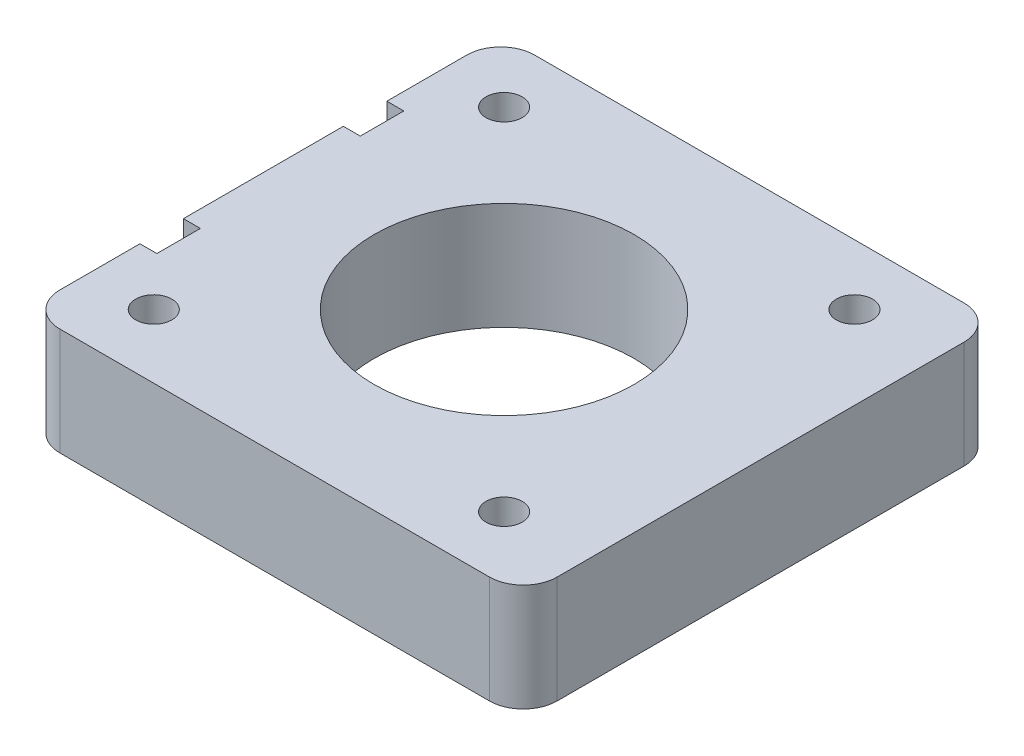
ISO-10303-21;
HEADER;
FILE_DESCRIPTION(('STEP AP214'),'2;1');
FILE_NAME('part.step','',(''),(''),'','','');
FILE_SCHEMA(('AUTOMOTIVE_DESIGN { 1 0 10303 214 1 1 1 1 }'));
ENDSEC;
DATA;
#1=APPLICATION_CONTEXT('core data for automotive mechanical design processes');
#2=APPLICATION_PROTOCOL_DEFINITION('international standard','automotive_design',2000,#1);
#3=PRODUCT_CONTEXT('',#1,'mechanical');
#4=PRODUCT('Part','Part','',(#3));
#5=PRODUCT_RELATED_PRODUCT_CATEGORY('part','',(#4));
#6=PRODUCT_DEFINITION_FORMATION('','',#4);
#7=PRODUCT_DEFINITION_CONTEXT('part definition',#1,'design');
#8=PRODUCT_DEFINITION('design','',#6,#7);
#9=PRODUCT_DEFINITION_SHAPE('','',#8);
#10=(LENGTH_UNIT() NAMED_UNIT(*) SI_UNIT(.MILLI.,.METRE.));
#11=(NAMED_UNIT(*) PLANE_ANGLE_UNIT() SI_UNIT($,.RADIAN.));
#12=(NAMED_UNIT(*) SI_UNIT($,.STERADIAN.) SOLID_ANGLE_UNIT());
#13=UNCERTAINTY_MEASURE_WITH_UNIT(LENGTH_MEASURE(1.E-05),#10,'distance_accuracy_value','');
#14=(GEOMETRIC_REPRESENTATION_CONTEXT(3) GLOBAL_UNCERTAINTY_ASSIGNED_CONTEXT((#13)) GLOBAL_UNIT_ASSIGNED_CONTEXT((#10,
#11,#12)) REPRESENTATION_CONTEXT('',''));
#15=CARTESIAN_POINT('',(0.,0.,0.));
#16=DIRECTION('',(0.,0.,1.));
#17=DIRECTION('',(1.,0.,0.));
#18=AXIS2_PLACEMENT_3D('',#15,#16,#17);
#19=CARTESIAN_POINT('',(0.,9.5,0.));
#20=DIRECTION('',(1.,0.,0.));
#21=DIRECTION('',(0.,0.,-1.));
#22=AXIS2_PLACEMENT_3D('',#19,#20,#21);
#23=PLANE('',#22);
#24=DIRECTION('',(0.,0.,1.));
#25=VECTOR('',#24,1.);
#26=CARTESIAN_POINT('',(0.,0.,0.));
#27=LINE('',#26,#25);
#28=CARTESIAN_POINT('',(0.,0.,3.));
#29=VERTEX_POINT('',#28);
#30=CARTESIAN_POINT('',(0.,0.,10.075));
#31=VERTEX_POINT('',#30);
#32=EDGE_CURVE('E245',#29,#31,#27,.T.);
#33=ORIENTED_EDGE('',*,*,#32,.T.);
#34=DIRECTION('',(0.,-1.,0.));
#35=VECTOR('',#34,1.);
#36=CARTESIAN_POINT('',(0.,9.5,10.075));
#37=LINE('',#36,#35);
#38=CARTESIAN_POINT('',(0.,9.5,10.075));
#39=VERTEX_POINT('',#38);
#40=EDGE_CURVE('E192',#39,#31,#37,.T.);
#41=ORIENTED_EDGE('',*,*,#40,.F.);
#42=DIRECTION('',(0.,0.,1.));
#43=VECTOR('',#42,1.);
#44=CARTESIAN_POINT('',(0.,9.5,0.));
#45=LINE('',#44,#43);
#46=CARTESIAN_POINT('',(0.,9.5,3.));
#47=VERTEX_POINT('',#46);
#48=EDGE_CURVE('E230',#47,#39,#45,.T.);
#49=ORIENTED_EDGE('',*,*,#48,.F.);
#50=DIRECTION('',(0.,-1.,0.));
#51=VECTOR('',#50,1.);
#52=CARTESIAN_POINT('',(0.,9.5,3.));
#53=LINE('',#52,#51);
#54=EDGE_CURVE('E286',#47,#29,#53,.T.);
#55=ORIENTED_EDGE('',*,*,#54,.T.);
#56=EDGE_LOOP('',(#33,#41,#49,#55));
#57=FACE_BOUND('',#56,.T.);
#58=ADVANCED_FACE('F35',(#57),#23,.F.);
#59=CARTESIAN_POINT('',(0.,9.5,13.925));
#60=VERTEX_POINT('',#59);
#61=CARTESIAN_POINT('',(0.,9.5,28.075));
#62=VERTEX_POINT('',#61);
#63=EDGE_CURVE('E234',#60,#62,#45,.T.);
#64=ORIENTED_EDGE('',*,*,#63,.F.);
#65=DIRECTION('',(0.,1.,0.));
#66=VECTOR('',#65,1.);
#67=CARTESIAN_POINT('',(0.,9.5,13.925));
#68=LINE('',#67,#66);
#69=CARTESIAN_POINT('',(0.,0.,13.925));
#70=VERTEX_POINT('',#69);
#71=EDGE_CURVE('E326',#70,#60,#68,.T.);
#72=ORIENTED_EDGE('',*,*,#71,.F.);
#73=CARTESIAN_POINT('',(0.,0.,28.075));
#74=VERTEX_POINT('',#73);
#75=EDGE_CURVE('E169',#70,#74,#27,.T.);
#76=ORIENTED_EDGE('',*,*,#75,.T.);
#77=DIRECTION('',(0.,-1.,0.));
#78=VECTOR('',#77,1.);
#79=CARTESIAN_POINT('',(0.,9.5,28.075));
#80=LINE('',#79,#78);
#81=EDGE_CURVE('E187',#62,#74,#80,.T.);
#82=ORIENTED_EDGE('',*,*,#81,.F.);
#83=EDGE_LOOP('',(#64,#72,#76,#82));
#84=FACE_BOUND('',#83,.T.);
#85=ADVANCED_FACE('F336',(#84),#23,.F.);
#86=CARTESIAN_POINT('',(0.,9.5,31.925));
#87=VERTEX_POINT('',#86);
#88=CARTESIAN_POINT('',(0.,9.5,39.));
#89=VERTEX_POINT('',#88);
#90=EDGE_CURVE('E235',#87,#89,#45,.T.);
#91=ORIENTED_EDGE('',*,*,#90,.F.);
#92=DIRECTION('',(0.,1.,0.));
#93=VECTOR('',#92,1.);
#94=CARTESIAN_POINT('',(0.,9.5,31.925));
#95=LINE('',#94,#93);
#96=CARTESIAN_POINT('',(0.,0.,31.925));
#97=VERTEX_POINT('',#96);
#98=EDGE_CURVE('E179',#97,#87,#95,.T.);
#99=ORIENTED_EDGE('',*,*,#98,.F.);
#100=CARTESIAN_POINT('',(0.,0.,39.));
#101=VERTEX_POINT('',#100);
#102=EDGE_CURVE('E227',#97,#101,#27,.T.);
#103=ORIENTED_EDGE('',*,*,#102,.T.);
#104=DIRECTION('',(0.,-1.,0.));
#105=VECTOR('',#104,1.);
#106=CARTESIAN_POINT('',(0.,9.5,39.));
#107=LINE('',#106,#105);
#108=EDGE_CURVE('E283',#101,#89,#107,.F.);
#109=ORIENTED_EDGE('',*,*,#108,.T.);
#110=EDGE_LOOP('',(#91,#99,#103,#109));
#111=FACE_BOUND('',#110,.T.);
#112=ADVANCED_FACE('F342',(#111),#23,.F.);
#113=CARTESIAN_POINT('',(0.,9.5,42.));
#114=DIRECTION('',(0.,0.,-1.));
#115=DIRECTION('',(-1.,0.,0.));
#116=AXIS2_PLACEMENT_3D('',#113,#114,#115);
#117=PLANE('',#116);
#118=DIRECTION('',(1.,0.,0.));
#119=VECTOR('',#118,1.);
#120=CARTESIAN_POINT('',(0.,9.5,42.));
#121=LINE('',#120,#119);
#122=CARTESIAN_POINT('',(3.,9.5,42.));
#123=VERTEX_POINT('',#122);
#124=CARTESIAN_POINT('',(41.,9.5,42.));
#125=VERTEX_POINT('',#124);
#126=EDGE_CURVE('E233',#123,#125,#121,.T.);
#127=ORIENTED_EDGE('',*,*,#126,.F.);
#128=DIRECTION('',(0.,-1.,0.));
#129=VECTOR('',#128,1.);
#130=CARTESIAN_POINT('',(3.,9.5,42.));
#131=LINE('',#130,#129);
#132=CARTESIAN_POINT('',(3.,0.,42.));
#133=VERTEX_POINT('',#132);
#134=EDGE_CURVE('E11',#123,#133,#131,.T.);
#135=ORIENTED_EDGE('',*,*,#134,.T.);
#136=DIRECTION('',(1.,0.,0.));
#137=VECTOR('',#136,1.);
#138=CARTESIAN_POINT('',(0.,0.,42.));
#139=LINE('',#138,#137);
#140=CARTESIAN_POINT('',(41.,0.,42.));
#141=VERTEX_POINT('',#140);
#142=EDGE_CURVE('E248',#133,#141,#139,.T.);
#143=ORIENTED_EDGE('',*,*,#142,.T.);
#144=DIRECTION('',(0.,-1.,0.));
#145=VECTOR('',#144,1.);
#146=CARTESIAN_POINT('',(41.,9.5,42.));
#147=LINE('',#146,#145);
#148=EDGE_CURVE('E43',#141,#125,#147,.F.);
#149=ORIENTED_EDGE('',*,*,#148,.T.);
#150=EDGE_LOOP('',(#127,#135,#143,#149));
#151=FACE_BOUND('',#150,.T.);
#152=ADVANCED_FACE('F291',(#151),#117,.F.);
#153=CARTESIAN_POINT('',(44.,9.5,0.));
#154=DIRECTION('',(-1.,0.,0.));
#155=DIRECTION('',(0.,0.,1.));
#156=AXIS2_PLACEMENT_3D('',#153,#154,#155);
#157=PLANE('',#156);
#158=DIRECTION('',(0.,0.,-1.));
#159=VECTOR('',#158,1.);
#160=CARTESIAN_POINT('',(44.,0.,0.));
#161=LINE('',#160,#159);
#162=CARTESIAN_POINT('',(44.,0.,39.));
#163=VERTEX_POINT('',#162);
#164=CARTESIAN_POINT('',(44.,0.,3.));
#165=VERTEX_POINT('',#164);
#166=EDGE_CURVE('E251',#163,#165,#161,.T.);
#167=ORIENTED_EDGE('',*,*,#166,.T.);
#168=DIRECTION('',(0.,-1.,0.));
#169=VECTOR('',#168,1.);
#170=CARTESIAN_POINT('',(44.,9.5,3.));
#171=LINE('',#170,#169);
#172=CARTESIAN_POINT('',(44.,9.5,3.));
#173=VERTEX_POINT('',#172);
#174=EDGE_CURVE('E273',#165,#173,#171,.F.);
#175=ORIENTED_EDGE('',*,*,#174,.T.);
#176=DIRECTION('',(0.,0.,-1.));
#177=VECTOR('',#176,1.);
#178=CARTESIAN_POINT('',(44.,9.5,0.));
#179=LINE('',#178,#177);
#180=CARTESIAN_POINT('',(44.,9.5,39.));
#181=VERTEX_POINT('',#180);
#182=EDGE_CURVE('E238',#181,#173,#179,.T.);
#183=ORIENTED_EDGE('',*,*,#182,.F.);
#184=DIRECTION('',(0.,-1.,0.));
#185=VECTOR('',#184,1.);
#186=CARTESIAN_POINT('',(44.,9.5,39.));
#187=LINE('',#186,#185);
#188=EDGE_CURVE('E270',#181,#163,#187,.T.);
#189=ORIENTED_EDGE('',*,*,#188,.T.);
#190=EDGE_LOOP('',(#167,#175,#183,#189));
#191=FACE_BOUND('',#190,.T.);
#192=ADVANCED_FACE('F305',(#191),#157,.F.);
#193=CARTESIAN_POINT('',(0.,9.5,0.));
#194=DIRECTION('',(0.,0.,1.));
#195=DIRECTION('',(1.,0.,0.));
#196=AXIS2_PLACEMENT_3D('',#193,#194,#195);
#197=PLANE('',#196);
#198=DIRECTION('',(-1.,0.,0.));
#199=VECTOR('',#198,1.);
#200=CARTESIAN_POINT('',(0.,9.5,0.));
#201=LINE('',#200,#199);
#202=CARTESIAN_POINT('',(41.,9.5,0.));
#203=VERTEX_POINT('',#202);
#204=CARTESIAN_POINT('',(3.,9.5,0.));
#205=VERTEX_POINT('',#204);
#206=EDGE_CURVE('E241',#203,#205,#201,.T.);
#207=ORIENTED_EDGE('',*,*,#206,.F.);
#208=DIRECTION('',(0.,-1.,0.));
#209=VECTOR('',#208,1.);
#210=CARTESIAN_POINT('',(41.,9.5,0.));
#211=LINE('',#210,#209);
#212=CARTESIAN_POINT('',(41.,0.,0.));
#213=VERTEX_POINT('',#212);
#214=EDGE_CURVE('E258',#203,#213,#211,.T.);
#215=ORIENTED_EDGE('',*,*,#214,.T.);
#216=DIRECTION('',(-1.,0.,0.));
#217=VECTOR('',#216,1.);
#218=CARTESIAN_POINT('',(0.,0.,0.));
#219=LINE('',#218,#217);
#220=CARTESIAN_POINT('',(3.,0.,0.));
#221=VERTEX_POINT('',#220);
#222=EDGE_CURVE('E254',#213,#221,#219,.T.);
#223=ORIENTED_EDGE('',*,*,#222,.T.);
#224=DIRECTION('',(0.,-1.,0.));
#225=VECTOR('',#224,1.);
#226=CARTESIAN_POINT('',(3.,9.5,0.));
#227=LINE('',#226,#225);
#228=EDGE_CURVE('E244',#221,#205,#227,.F.);
#229=ORIENTED_EDGE('',*,*,#228,.T.);
#230=EDGE_LOOP('',(#207,#215,#223,#229));
#231=FACE_BOUND('',#230,.T.);
#232=ADVANCED_FACE('F314',(#231),#197,.F.);
#233=CARTESIAN_POINT('',(0.,9.5,0.));
#234=DIRECTION('',(0.,1.,0.));
#235=DIRECTION('',(0.,0.,1.));
#236=AXIS2_PLACEMENT_3D('',#233,#234,#235);
#237=PLANE('',#236);
#238=DIRECTION('',(-1.,0.,0.));
#239=VECTOR('',#238,1.);
#240=CARTESIAN_POINT('',(1.5,9.5,10.075));
#241=LINE('',#240,#239);
#242=CARTESIAN_POINT('',(1.5,9.5,10.075));
#243=VERTEX_POINT('',#242);
#244=EDGE_CURVE('E172',#243,#39,#241,.T.);
#245=ORIENTED_EDGE('',*,*,#244,.F.);
#246=DIRECTION('',(0.,0.,-1.));
#247=VECTOR('',#246,1.);
#248=CARTESIAN_POINT('',(1.5,9.5,10.075));
#249=LINE('',#248,#247);
#250=CARTESIAN_POINT('',(1.5,9.5,13.925));
#251=VERTEX_POINT('',#250);
#252=EDGE_CURVE('E157',#251,#243,#249,.T.);
#253=ORIENTED_EDGE('',*,*,#252,.F.);
#254=DIRECTION('',(-1.,0.,0.));
#255=VECTOR('',#254,1.);
#256=CARTESIAN_POINT('',(1.5,9.5,13.925));
#257=LINE('',#256,#255);
#258=EDGE_CURVE('E155',#251,#60,#257,.T.);
#259=ORIENTED_EDGE('',*,*,#258,.T.);
#260=ORIENTED_EDGE('',*,*,#63,.T.);
#261=DIRECTION('',(-1.,0.,0.));
#262=VECTOR('',#261,1.);
#263=CARTESIAN_POINT('',(1.5,9.5,28.075));
#264=LINE('',#263,#262);
#265=CARTESIAN_POINT('',(1.5,9.5,28.075));
#266=VERTEX_POINT('',#265);
#267=EDGE_CURVE('E190',#266,#62,#264,.T.);
#268=ORIENTED_EDGE('',*,*,#267,.F.);
#269=DIRECTION('',(0.,0.,-1.));
#270=VECTOR('',#269,1.);
#271=CARTESIAN_POINT('',(1.5,9.5,28.075));
#272=LINE('',#271,#270);
#273=CARTESIAN_POINT('',(1.5,9.5,31.925));
#274=VERTEX_POINT('',#273);
#275=EDGE_CURVE('E184',#274,#266,#272,.T.);
#276=ORIENTED_EDGE('',*,*,#275,.F.);
#277=DIRECTION('',(-1.,0.,0.));
#278=VECTOR('',#277,1.);
#279=CARTESIAN_POINT('',(1.5,9.5,31.925));
#280=LINE('',#279,#278);
#281=EDGE_CURVE('E193',#274,#87,#280,.T.);
#282=ORIENTED_EDGE('',*,*,#281,.T.);
#283=ORIENTED_EDGE('',*,*,#90,.T.);
#284=CARTESIAN_POINT('',(3.,9.5,39.));
#285=DIRECTION('',(0.,1.,0.));
#286=DIRECTION('',(0.,0.,1.));
#287=AXIS2_PLACEMENT_3D('',#284,#285,#286);
#288=CIRCLE('',#287,3.);
#289=EDGE_CURVE('E277',#89,#123,#288,.T.);
#290=ORIENTED_EDGE('',*,*,#289,.T.);
#291=ORIENTED_EDGE('',*,*,#126,.T.);
#292=CARTESIAN_POINT('',(41.,9.5,39.));
#293=DIRECTION('',(0.,1.,0.));
#294=DIRECTION('',(0.,0.,1.));
#295=AXIS2_PLACEMENT_3D('',#292,#293,#294);
#296=CIRCLE('',#295,3.);
#297=EDGE_CURVE('E275',#125,#181,#296,.T.);
#298=ORIENTED_EDGE('',*,*,#297,.T.);
#299=ORIENTED_EDGE('',*,*,#182,.T.);
#300=CARTESIAN_POINT('',(41.,9.5,3.));
#301=DIRECTION('',(0.,1.,0.));
#302=DIRECTION('',(0.,0.,1.));
#303=AXIS2_PLACEMENT_3D('',#300,#301,#302);
#304=CIRCLE('',#303,3.);
#305=EDGE_CURVE('E281',#173,#203,#304,.T.);
#306=ORIENTED_EDGE('',*,*,#305,.T.);
#307=ORIENTED_EDGE('',*,*,#206,.T.);
#308=CARTESIAN_POINT('',(3.,9.5,3.));
#309=DIRECTION('',(0.,1.,0.));
#310=DIRECTION('',(0.,0.,1.));
#311=AXIS2_PLACEMENT_3D('',#308,#309,#310);
#312=CIRCLE('',#311,3.);
#313=EDGE_CURVE('E279',#205,#47,#312,.T.);
#314=ORIENTED_EDGE('',*,*,#313,.T.);
#315=ORIENTED_EDGE('',*,*,#48,.T.);
#316=EDGE_LOOP('',(#245,#253,#259,#260,#268,#276,#282,#283,#290,#291,#298,#299,#306,#307,#314,#315));
#317=FACE_BOUND('',#316,.T.);
#318=CARTESIAN_POINT('',(36.65,9.5,5.34999999999999));
#319=DIRECTION('',(0.,-1.,0.));
#320=DIRECTION('',(0.,0.,-1.));
#321=AXIS2_PLACEMENT_3D('',#318,#319,#320);
#322=CIRCLE('',#321,1.6);
#323=CARTESIAN_POINT('',(36.65,9.5,3.75));
#324=VERTEX_POINT('',#323);
#325=EDGE_CURVE('E212',#324,#324,#322,.T.);
#326=ORIENTED_EDGE('',*,*,#325,.T.);
#327=EDGE_LOOP('',(#326));
#328=FACE_BOUND('',#327,.T.);
#329=CARTESIAN_POINT('',(5.65,9.5,5.35000000000088));
#330=DIRECTION('',(0.,-1.,0.));
#331=DIRECTION('',(0.,0.,-1.));
#332=AXIS2_PLACEMENT_3D('',#329,#330,#331);
#333=CIRCLE('',#332,1.6);
#334=CARTESIAN_POINT('',(5.65,9.5,3.75000000000088));
#335=VERTEX_POINT('',#334);
#336=EDGE_CURVE('E206',#335,#335,#333,.T.);
#337=ORIENTED_EDGE('',*,*,#336,.T.);
#338=EDGE_LOOP('',(#337));
#339=FACE_BOUND('',#338,.T.);
#340=CARTESIAN_POINT('',(5.65000000000089,9.5,36.3500000000009));
#341=DIRECTION('',(0.,-1.,0.));
#342=DIRECTION('',(0.,0.,-1.));
#343=AXIS2_PLACEMENT_3D('',#340,#341,#342);
#344=CIRCLE('',#343,1.6);
#345=CARTESIAN_POINT('',(5.65000000000089,9.5,34.7500000000009));
#346=VERTEX_POINT('',#345);
#347=EDGE_CURVE('E199',#346,#346,#344,.T.);
#348=ORIENTED_EDGE('',*,*,#347,.T.);
#349=EDGE_LOOP('',(#348));
#350=FACE_BOUND('',#349,.T.);
#351=CARTESIAN_POINT('',(36.6500000000009,9.5,36.35));
#352=DIRECTION('',(0.,-1.,0.));
#353=DIRECTION('',(0.,0.,-1.));
#354=AXIS2_PLACEMENT_3D('',#351,#352,#353);
#355=CIRCLE('',#354,1.6);
#356=CARTESIAN_POINT('',(36.6500000000009,9.5,34.75));
#357=VERTEX_POINT('',#356);
#358=EDGE_CURVE('E218',#357,#357,#355,.T.);
#359=ORIENTED_EDGE('',*,*,#358,.T.);
#360=EDGE_LOOP('',(#359));
#361=FACE_BOUND('',#360,.T.);
#362=CARTESIAN_POINT('',(21.1499999999992,9.5,20.8499999999997));
#363=DIRECTION('',(0.,1.,0.));
#364=DIRECTION('',(0.,0.,1.));
#365=AXIS2_PLACEMENT_3D('',#362,#363,#364);
#366=CIRCLE('',#365,11.5);
#367=CARTESIAN_POINT('',(21.1499999999992,9.5,32.3499999999997));
#368=VERTEX_POINT('',#367);
#369=EDGE_CURVE('E221',#368,#368,#366,.T.);
#370=ORIENTED_EDGE('',*,*,#369,.F.);
#371=EDGE_LOOP('',(#370));
#372=FACE_BOUND('',#371,.T.);
#373=ADVANCED_FACE('F298',(#317,#328,#339,#350,#361,#372),#237,.T.);
#374=CARTESIAN_POINT('',(0.,0.,0.));
#375=DIRECTION('',(0.,1.,0.));
#376=DIRECTION('',(0.,0.,1.));
#377=AXIS2_PLACEMENT_3D('',#374,#375,#376);
#378=PLANE('',#377);
#379=CARTESIAN_POINT('',(36.65,0.,5.34999999999999));
#380=DIRECTION('',(0.,-1.,0.));
#381=DIRECTION('',(0.,0.,-1.));
#382=AXIS2_PLACEMENT_3D('',#379,#380,#381);
#383=CIRCLE('',#382,1.6);
#384=CARTESIAN_POINT('',(36.65,0.,3.75));
#385=VERTEX_POINT('',#384);
#386=EDGE_CURVE('E215',#385,#385,#383,.T.);
#387=ORIENTED_EDGE('',*,*,#386,.F.);
#388=EDGE_LOOP('',(#387));
#389=FACE_BOUND('',#388,.T.);
#390=CARTESIAN_POINT('',(5.65,0.,5.35000000000088));
#391=DIRECTION('',(0.,-1.,0.));
#392=DIRECTION('',(0.,0.,-1.));
#393=AXIS2_PLACEMENT_3D('',#390,#391,#392);
#394=CIRCLE('',#393,1.6);
#395=CARTESIAN_POINT('',(5.65,0.,3.75000000000088));
#396=VERTEX_POINT('',#395);
#397=EDGE_CURVE('E209',#396,#396,#394,.T.);
#398=ORIENTED_EDGE('',*,*,#397,.F.);
#399=EDGE_LOOP('',(#398));
#400=FACE_BOUND('',#399,.T.);
#401=CARTESIAN_POINT('',(5.65000000000089,0.,36.3500000000009));
#402=DIRECTION('',(0.,-1.,0.));
#403=DIRECTION('',(0.,0.,-1.));
#404=AXIS2_PLACEMENT_3D('',#401,#402,#403);
#405=CIRCLE('',#404,1.6);
#406=CARTESIAN_POINT('',(5.65000000000089,0.,34.7500000000009));
#407=VERTEX_POINT('',#406);
#408=EDGE_CURVE('E203',#407,#407,#405,.T.);
#409=ORIENTED_EDGE('',*,*,#408,.F.);
#410=EDGE_LOOP('',(#409));
#411=FACE_BOUND('',#410,.T.);
#412=CARTESIAN_POINT('',(36.6500000000009,0.,36.35));
#413=DIRECTION('',(0.,-1.,0.));
#414=DIRECTION('',(0.,0.,-1.));
#415=AXIS2_PLACEMENT_3D('',#412,#413,#414);
#416=CIRCLE('',#415,1.6);
#417=CARTESIAN_POINT('',(36.6500000000009,0.,34.75));
#418=VERTEX_POINT('',#417);
#419=EDGE_CURVE('E202',#418,#418,#416,.T.);
#420=ORIENTED_EDGE('',*,*,#419,.F.);
#421=EDGE_LOOP('',(#420));
#422=FACE_BOUND('',#421,.T.);
#423=CARTESIAN_POINT('',(21.1499999999992,0.,20.8499999999997));
#424=DIRECTION('',(0.,1.,0.));
#425=DIRECTION('',(0.,0.,1.));
#426=AXIS2_PLACEMENT_3D('',#423,#424,#425);
#427=CIRCLE('',#426,11.5);
#428=CARTESIAN_POINT('',(21.1499999999992,0.,32.3499999999997));
#429=VERTEX_POINT('',#428);
#430=EDGE_CURVE('E224',#429,#429,#427,.T.);
#431=ORIENTED_EDGE('',*,*,#430,.T.);
#432=EDGE_LOOP('',(#431));
#433=FACE_BOUND('',#432,.T.);
#434=DIRECTION('',(0.,0.,1.));
#435=VECTOR('',#434,1.);
#436=CARTESIAN_POINT('',(1.5,0.,10.075));
#437=LINE('',#436,#435);
#438=CARTESIAN_POINT('',(1.5,0.,10.075));
#439=VERTEX_POINT('',#438);
#440=CARTESIAN_POINT('',(1.5,0.,13.925));
#441=VERTEX_POINT('',#440);
#442=EDGE_CURVE('E158',#439,#441,#437,.T.);
#443=ORIENTED_EDGE('',*,*,#442,.F.);
#444=DIRECTION('',(-1.,0.,0.));
#445=VECTOR('',#444,1.);
#446=CARTESIAN_POINT('',(1.5,0.,10.075));
#447=LINE('',#446,#445);
#448=EDGE_CURVE('E170',#439,#31,#447,.T.);
#449=ORIENTED_EDGE('',*,*,#448,.T.);
#450=ORIENTED_EDGE('',*,*,#32,.F.);
#451=CARTESIAN_POINT('',(3.,0.,3.));
#452=DIRECTION('',(0.,1.,0.));
#453=DIRECTION('',(0.,0.,1.));
#454=AXIS2_PLACEMENT_3D('',#451,#452,#453);
#455=CIRCLE('',#454,3.);
#456=EDGE_CURVE('E266',#29,#221,#455,.F.);
#457=ORIENTED_EDGE('',*,*,#456,.T.);
#458=ORIENTED_EDGE('',*,*,#222,.F.);
#459=CARTESIAN_POINT('',(41.,0.,3.));
#460=DIRECTION('',(0.,1.,0.));
#461=DIRECTION('',(0.,0.,1.));
#462=AXIS2_PLACEMENT_3D('',#459,#460,#461);
#463=CIRCLE('',#462,3.);
#464=EDGE_CURVE('E268',#213,#165,#463,.F.);
#465=ORIENTED_EDGE('',*,*,#464,.T.);
#466=ORIENTED_EDGE('',*,*,#166,.F.);
#467=CARTESIAN_POINT('',(41.,0.,39.));
#468=DIRECTION('',(0.,1.,0.));
#469=DIRECTION('',(0.,0.,1.));
#470=AXIS2_PLACEMENT_3D('',#467,#468,#469);
#471=CIRCLE('',#470,3.);
#472=EDGE_CURVE('E261',#163,#141,#471,.F.);
#473=ORIENTED_EDGE('',*,*,#472,.T.);
#474=ORIENTED_EDGE('',*,*,#142,.F.);
#475=CARTESIAN_POINT('',(3.,0.,39.));
#476=DIRECTION('',(0.,1.,0.));
#477=DIRECTION('',(0.,0.,1.));
#478=AXIS2_PLACEMENT_3D('',#475,#476,#477);
#479=CIRCLE('',#478,3.);
#480=EDGE_CURVE('E263',#133,#101,#479,.F.);
#481=ORIENTED_EDGE('',*,*,#480,.T.);
#482=ORIENTED_EDGE('',*,*,#102,.F.);
#483=DIRECTION('',(-1.,0.,0.));
#484=VECTOR('',#483,1.);
#485=CARTESIAN_POINT('',(1.5,0.,31.925));
#486=LINE('',#485,#484);
#487=CARTESIAN_POINT('',(1.5,0.,31.925));
#488=VERTEX_POINT('',#487);
#489=EDGE_CURVE('E196',#488,#97,#486,.T.);
#490=ORIENTED_EDGE('',*,*,#489,.F.);
#491=DIRECTION('',(0.,0.,1.));
#492=VECTOR('',#491,1.);
#493=CARTESIAN_POINT('',(1.5,0.,28.075));
#494=LINE('',#493,#492);
#495=CARTESIAN_POINT('',(1.5,0.,28.075));
#496=VERTEX_POINT('',#495);
#497=EDGE_CURVE('E178',#496,#488,#494,.T.);
#498=ORIENTED_EDGE('',*,*,#497,.F.);
#499=DIRECTION('',(-1.,0.,0.));
#500=VECTOR('',#499,1.);
#501=CARTESIAN_POINT('',(1.5,0.,28.075));
#502=LINE('',#501,#500);
#503=EDGE_CURVE('E186',#496,#74,#502,.T.);
#504=ORIENTED_EDGE('',*,*,#503,.T.);
#505=ORIENTED_EDGE('',*,*,#75,.F.);
#506=DIRECTION('',(-1.,0.,0.));
#507=VECTOR('',#506,1.);
#508=CARTESIAN_POINT('',(1.5,0.,13.925));
#509=LINE('',#508,#507);
#510=EDGE_CURVE('E152',#441,#70,#509,.T.);
#511=ORIENTED_EDGE('',*,*,#510,.F.);
#512=EDGE_LOOP('',(#443,#449,#450,#457,#458,#465,#466,#473,#474,#481,#482,#490,#498,#504,#505,#511));
#513=FACE_BOUND('',#512,.T.);
#514=ADVANCED_FACE('F166',(#389,#400,#411,#422,#433,#513),#378,.F.);
#515=CARTESIAN_POINT('',(21.1499999999992,0.,20.8499999999997));
#516=DIRECTION('',(0.,1.,0.));
#517=DIRECTION('',(0.,0.,1.));
#518=AXIS2_PLACEMENT_3D('',#515,#516,#517);
#519=CYLINDRICAL_SURFACE('',#518,11.5);
#520=ORIENTED_EDGE('',*,*,#430,.F.);
#521=EDGE_LOOP('',(#520));
#522=FACE_BOUND('',#521,.T.);
#523=ORIENTED_EDGE('',*,*,#369,.T.);
#524=EDGE_LOOP('',(#523));
#525=FACE_BOUND('',#524,.T.);
#526=ADVANCED_FACE('F380',(#522,#525),#519,.F.);
#527=CARTESIAN_POINT('',(41.,9.5,3.));
#528=DIRECTION('',(0.,-1.,0.));
#529=DIRECTION('',(0.,0.,-1.));
#530=AXIS2_PLACEMENT_3D('',#527,#528,#529);
#531=CYLINDRICAL_SURFACE('',#530,3.);
#532=ORIENTED_EDGE('',*,*,#305,.F.);
#533=ORIENTED_EDGE('',*,*,#174,.F.);
#534=ORIENTED_EDGE('',*,*,#464,.F.);
#535=ORIENTED_EDGE('',*,*,#214,.F.);
#536=EDGE_LOOP('',(#532,#533,#534,#535));
#537=FACE_BOUND('',#536,.T.);
#538=ADVANCED_FACE('F311',(#537),#531,.T.);
#539=CARTESIAN_POINT('',(3.,9.5,3.));
#540=DIRECTION('',(0.,-1.,0.));
#541=DIRECTION('',(0.,0.,-1.));
#542=AXIS2_PLACEMENT_3D('',#539,#540,#541);
#543=CYLINDRICAL_SURFACE('',#542,3.);
#544=ORIENTED_EDGE('',*,*,#313,.F.);
#545=ORIENTED_EDGE('',*,*,#228,.F.);
#546=ORIENTED_EDGE('',*,*,#456,.F.);
#547=ORIENTED_EDGE('',*,*,#54,.F.);
#548=EDGE_LOOP('',(#544,#545,#546,#547));
#549=FACE_BOUND('',#548,.T.);
#550=ADVANCED_FACE('F320',(#549),#543,.T.);
#551=CARTESIAN_POINT('',(3.,9.5,39.));
#552=DIRECTION('',(0.,-1.,0.));
#553=DIRECTION('',(0.,0.,-1.));
#554=AXIS2_PLACEMENT_3D('',#551,#552,#553);
#555=CYLINDRICAL_SURFACE('',#554,3.);
#556=ORIENTED_EDGE('',*,*,#289,.F.);
#557=ORIENTED_EDGE('',*,*,#108,.F.);
#558=ORIENTED_EDGE('',*,*,#480,.F.);
#559=ORIENTED_EDGE('',*,*,#134,.F.);
#560=EDGE_LOOP('',(#556,#557,#558,#559));
#561=FACE_BOUND('',#560,.T.);
#562=ADVANCED_FACE('F345',(#561),#555,.T.);
#563=CARTESIAN_POINT('',(41.,9.5,39.));
#564=DIRECTION('',(0.,-1.,0.));
#565=DIRECTION('',(0.,0.,-1.));
#566=AXIS2_PLACEMENT_3D('',#563,#564,#565);
#567=CYLINDRICAL_SURFACE('',#566,3.);
#568=ORIENTED_EDGE('',*,*,#297,.F.);
#569=ORIENTED_EDGE('',*,*,#148,.F.);
#570=ORIENTED_EDGE('',*,*,#472,.F.);
#571=ORIENTED_EDGE('',*,*,#188,.F.);
#572=EDGE_LOOP('',(#568,#569,#570,#571));
#573=FACE_BOUND('',#572,.T.);
#574=ADVANCED_FACE('F37',(#573),#567,.T.);
#575=CARTESIAN_POINT('',(36.6500000000009,9.5,36.35));
#576=DIRECTION('',(0.,-1.,0.));
#577=DIRECTION('',(0.,0.,-1.));
#578=AXIS2_PLACEMENT_3D('',#575,#576,#577);
#579=CYLINDRICAL_SURFACE('',#578,1.6);
#580=ORIENTED_EDGE('',*,*,#358,.F.);
#581=EDGE_LOOP('',(#580));
#582=FACE_BOUND('',#581,.T.);
#583=ORIENTED_EDGE('',*,*,#419,.T.);
#584=EDGE_LOOP('',(#583));
#585=FACE_BOUND('',#584,.T.);
#586=ADVANCED_FACE('F387',(#582,#585),#579,.F.);
#587=CARTESIAN_POINT('',(5.65000000000089,9.5,36.3500000000009));
#588=DIRECTION('',(0.,-1.,0.));
#589=DIRECTION('',(0.,0.,-1.));
#590=AXIS2_PLACEMENT_3D('',#587,#588,#589);
#591=CYLINDRICAL_SURFACE('',#590,1.6);
#592=ORIENTED_EDGE('',*,*,#347,.F.);
#593=EDGE_LOOP('',(#592));
#594=FACE_BOUND('',#593,.T.);
#595=ORIENTED_EDGE('',*,*,#408,.T.);
#596=EDGE_LOOP('',(#595));
#597=FACE_BOUND('',#596,.T.);
#598=ADVANCED_FACE('F390',(#594,#597),#591,.F.);
#599=CARTESIAN_POINT('',(5.65,9.5,5.35000000000088));
#600=DIRECTION('',(0.,-1.,0.));
#601=DIRECTION('',(0.,0.,-1.));
#602=AXIS2_PLACEMENT_3D('',#599,#600,#601);
#603=CYLINDRICAL_SURFACE('',#602,1.6);
#604=ORIENTED_EDGE('',*,*,#336,.F.);
#605=EDGE_LOOP('',(#604));
#606=FACE_BOUND('',#605,.T.);
#607=ORIENTED_EDGE('',*,*,#397,.T.);
#608=EDGE_LOOP('',(#607));
#609=FACE_BOUND('',#608,.T.);
#610=ADVANCED_FACE('F395',(#606,#609),#603,.F.);
#611=CARTESIAN_POINT('',(36.65,9.5,5.34999999999999));
#612=DIRECTION('',(0.,-1.,0.));
#613=DIRECTION('',(0.,0.,-1.));
#614=AXIS2_PLACEMENT_3D('',#611,#612,#613);
#615=CYLINDRICAL_SURFACE('',#614,1.6);
#616=ORIENTED_EDGE('',*,*,#325,.F.);
#617=EDGE_LOOP('',(#616));
#618=FACE_BOUND('',#617,.T.);
#619=ORIENTED_EDGE('',*,*,#386,.T.);
#620=EDGE_LOOP('',(#619));
#621=FACE_BOUND('',#620,.T.);
#622=ADVANCED_FACE('F392',(#618,#621),#615,.F.);
#623=CARTESIAN_POINT('',(1.5,9.5,28.075));
#624=DIRECTION('',(0.,0.,-1.));
#625=DIRECTION('',(-1.,0.,0.));
#626=AXIS2_PLACEMENT_3D('',#623,#624,#625);
#627=PLANE('',#626);
#628=ORIENTED_EDGE('',*,*,#81,.T.);
#629=ORIENTED_EDGE('',*,*,#503,.F.);
#630=DIRECTION('',(0.,-1.,0.));
#631=VECTOR('',#630,1.);
#632=CARTESIAN_POINT('',(1.5,9.5,28.075));
#633=LINE('',#632,#631);
#634=EDGE_CURVE('E58',#266,#496,#633,.T.);
#635=ORIENTED_EDGE('',*,*,#634,.F.);
#636=ORIENTED_EDGE('',*,*,#267,.T.);
#637=EDGE_LOOP('',(#628,#629,#635,#636));
#638=FACE_BOUND('',#637,.T.);
#639=ADVANCED_FACE('F358',(#638),#627,.F.);
#640=CARTESIAN_POINT('',(1.5,9.5,31.925));
#641=DIRECTION('',(0.,0.,1.));
#642=DIRECTION('',(1.,0.,0.));
#643=AXIS2_PLACEMENT_3D('',#640,#641,#642);
#644=PLANE('',#643);
#645=ORIENTED_EDGE('',*,*,#98,.T.);
#646=ORIENTED_EDGE('',*,*,#281,.F.);
#647=DIRECTION('',(0.,1.,0.));
#648=VECTOR('',#647,1.);
#649=CARTESIAN_POINT('',(1.5,9.5,31.925));
#650=LINE('',#649,#648);
#651=EDGE_CURVE('E181',#488,#274,#650,.T.);
#652=ORIENTED_EDGE('',*,*,#651,.F.);
#653=ORIENTED_EDGE('',*,*,#489,.T.);
#654=EDGE_LOOP('',(#645,#646,#652,#653));
#655=FACE_BOUND('',#654,.T.);
#656=ADVANCED_FACE('F349',(#655),#644,.F.);
#657=CARTESIAN_POINT('',(1.5,0.,0.));
#658=DIRECTION('',(-1.,0.,0.));
#659=DIRECTION('',(0.,0.,1.));
#660=AXIS2_PLACEMENT_3D('',#657,#658,#659);
#661=PLANE('',#660);
#662=ORIENTED_EDGE('',*,*,#634,.T.);
#663=ORIENTED_EDGE('',*,*,#497,.T.);
#664=ORIENTED_EDGE('',*,*,#651,.T.);
#665=ORIENTED_EDGE('',*,*,#275,.T.);
#666=EDGE_LOOP('',(#662,#663,#664,#665));
#667=FACE_BOUND('',#666,.T.);
#668=ADVANCED_FACE('F350',(#667),#661,.T.);
#669=CARTESIAN_POINT('',(1.5,9.5,10.075));
#670=DIRECTION('',(0.,0.,-1.));
#671=DIRECTION('',(-1.,0.,0.));
#672=AXIS2_PLACEMENT_3D('',#669,#670,#671);
#673=PLANE('',#672);
#674=ORIENTED_EDGE('',*,*,#40,.T.);
#675=ORIENTED_EDGE('',*,*,#448,.F.);
#676=DIRECTION('',(0.,-1.,0.));
#677=VECTOR('',#676,1.);
#678=CARTESIAN_POINT('',(1.5,9.5,10.075));
#679=LINE('',#678,#677);
#680=EDGE_CURVE('E50',#243,#439,#679,.T.);
#681=ORIENTED_EDGE('',*,*,#680,.F.);
#682=ORIENTED_EDGE('',*,*,#244,.T.);
#683=EDGE_LOOP('',(#674,#675,#681,#682));
#684=FACE_BOUND('',#683,.T.);
#685=ADVANCED_FACE('F325',(#684),#673,.F.);
#686=CARTESIAN_POINT('',(1.5,9.5,13.925));
#687=DIRECTION('',(0.,0.,1.));
#688=DIRECTION('',(1.,0.,0.));
#689=AXIS2_PLACEMENT_3D('',#686,#687,#688);
#690=PLANE('',#689);
#691=ORIENTED_EDGE('',*,*,#71,.T.);
#692=ORIENTED_EDGE('',*,*,#258,.F.);
#693=DIRECTION('',(0.,1.,0.));
#694=VECTOR('',#693,1.);
#695=CARTESIAN_POINT('',(1.5,9.5,13.925));
#696=LINE('',#695,#694);
#697=EDGE_CURVE('E149',#441,#251,#696,.T.);
#698=ORIENTED_EDGE('',*,*,#697,.F.);
#699=ORIENTED_EDGE('',*,*,#510,.T.);
#700=EDGE_LOOP('',(#691,#692,#698,#699));
#701=FACE_BOUND('',#700,.T.);
#702=ADVANCED_FACE('F150',(#701),#690,.F.);
#703=CARTESIAN_POINT('',(1.5,0.,0.));
#704=DIRECTION('',(-1.,0.,0.));
#705=DIRECTION('',(0.,0.,1.));
#706=AXIS2_PLACEMENT_3D('',#703,#704,#705);
#707=PLANE('',#706);
#708=ORIENTED_EDGE('',*,*,#680,.T.);
#709=ORIENTED_EDGE('',*,*,#442,.T.);
#710=ORIENTED_EDGE('',*,*,#697,.T.);
#711=ORIENTED_EDGE('',*,*,#252,.T.);
#712=EDGE_LOOP('',(#708,#709,#710,#711));
#713=FACE_BOUND('',#712,.T.);
#714=ADVANCED_FACE('F161',(#713),#707,.T.);
#715=CLOSED_SHELL('',(#58,#85,#112,#152,#192,#232,#373,#514,#526,#538,#550,#562,#574,#586,#598,
#610,#622,#639,#656,#668,#685,#702,#714));
#716=MANIFOLD_SOLID_BREP('B2',#715);
#717=ADVANCED_BREP_SHAPE_REPRESENTATION('',(#18,#716),#14);
#718=SHAPE_DEFINITION_REPRESENTATION(#9,#717);
ENDSEC;
END-ISO-10303-21;
